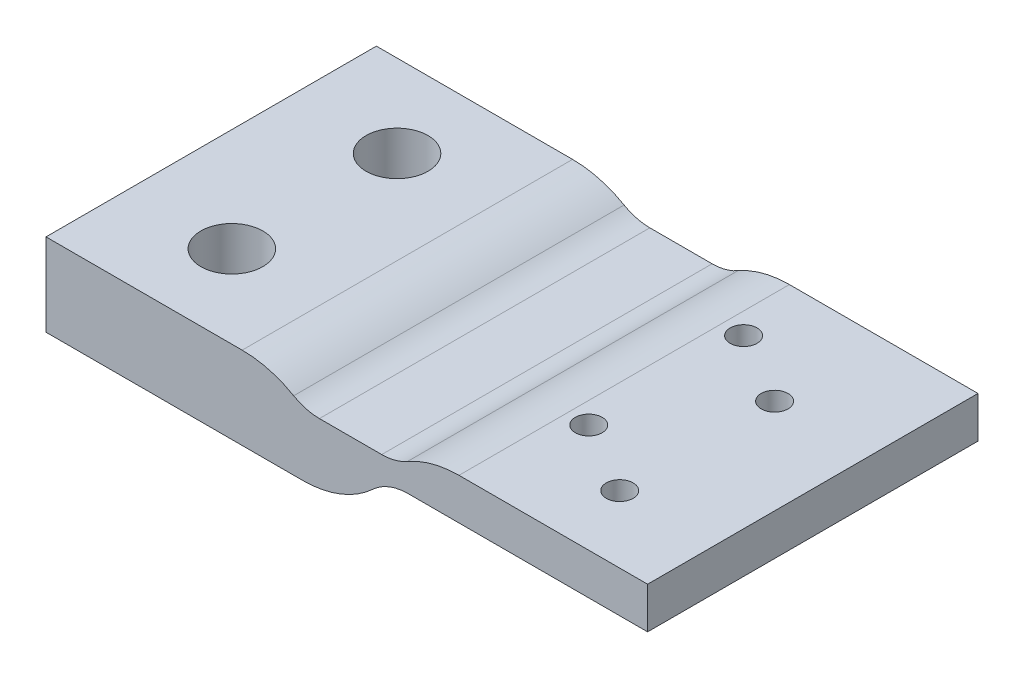
ISO-10303-21;
HEADER;
FILE_DESCRIPTION(('STEP AP214'),'2;1');
FILE_NAME('part.step','',(''),(''),'','','');
FILE_SCHEMA(('AUTOMOTIVE_DESIGN { 1 0 10303 214 1 1 1 1 }'));
ENDSEC;
DATA;
#1=APPLICATION_CONTEXT('core data for automotive mechanical design processes');
#2=APPLICATION_PROTOCOL_DEFINITION('international standard','automotive_design',2000,#1);
#3=PRODUCT_CONTEXT('',#1,'mechanical');
#4=PRODUCT('Part','Part','',(#3));
#5=PRODUCT_RELATED_PRODUCT_CATEGORY('part','',(#4));
#6=PRODUCT_DEFINITION_FORMATION('','',#4);
#7=PRODUCT_DEFINITION_CONTEXT('part definition',#1,'design');
#8=PRODUCT_DEFINITION('design','',#6,#7);
#9=PRODUCT_DEFINITION_SHAPE('','',#8);
#10=(LENGTH_UNIT() NAMED_UNIT(*) SI_UNIT(.MILLI.,.METRE.));
#11=(NAMED_UNIT(*) PLANE_ANGLE_UNIT() SI_UNIT($,.RADIAN.));
#12=(NAMED_UNIT(*) SI_UNIT($,.STERADIAN.) SOLID_ANGLE_UNIT());
#13=UNCERTAINTY_MEASURE_WITH_UNIT(LENGTH_MEASURE(1.E-05),#10,'distance_accuracy_value','');
#14=(GEOMETRIC_REPRESENTATION_CONTEXT(3) GLOBAL_UNCERTAINTY_ASSIGNED_CONTEXT((#13)) GLOBAL_UNIT_ASSIGNED_CONTEXT((#10,
#11,#12)) REPRESENTATION_CONTEXT('',''));
#15=CARTESIAN_POINT('',(0.,0.,0.));
#16=DIRECTION('',(0.,0.,1.));
#17=DIRECTION('',(1.,0.,0.));
#18=AXIS2_PLACEMENT_3D('',#15,#16,#17);
#19=CARTESIAN_POINT('',(0.,-3.,0.));
#20=DIRECTION('',(0.,1.,0.));
#21=DIRECTION('',(0.,0.,1.));
#22=AXIS2_PLACEMENT_3D('',#19,#20,#21);
#23=PLANE('',#22);
#24=DIRECTION('',(-1.,0.,0.));
#25=VECTOR('',#24,1.);
#26=CARTESIAN_POINT('',(-10.6666666666667,-3.,-16.));
#27=LINE('',#26,#25);
#28=CARTESIAN_POINT('',(-2.46666666666651,-3.,-16.));
#29=VERTEX_POINT('',#28);
#30=CARTESIAN_POINT('',(-10.6666666666667,-3.,-16.));
#31=VERTEX_POINT('',#30);
#32=EDGE_CURVE('E214',#29,#31,#27,.T.);
#33=ORIENTED_EDGE('',*,*,#32,.F.);
#34=CARTESIAN_POINT('',(-0.666666666666669,-3.,-7.99999999999998));
#35=DIRECTION('',(0.,1.,0.));
#36=DIRECTION('',(0.,0.,1.));
#37=AXIS2_PLACEMENT_3D('',#34,#35,#36);
#38=CIRCLE('',#37,8.2);
#39=CARTESIAN_POINT('',(-8.86666666666667,-3.,-7.99999999999998));
#40=VERTEX_POINT('',#39);
#41=EDGE_CURVE('E290',#29,#40,#38,.T.);
#42=ORIENTED_EDGE('',*,*,#41,.T.);
#43=DIRECTION('',(0.,0.,1.));
#44=VECTOR('',#43,1.);
#45=CARTESIAN_POINT('',(-8.86666666666667,-3.,0.));
#46=LINE('',#45,#44);
#47=CARTESIAN_POINT('',(-8.86666666666667,-3.,7.99999999999999));
#48=VERTEX_POINT('',#47);
#49=EDGE_CURVE('E173',#40,#48,#46,.T.);
#50=ORIENTED_EDGE('',*,*,#49,.T.);
#51=CARTESIAN_POINT('',(-0.666666666666668,-3.,7.99999999999999));
#52=DIRECTION('',(0.,1.,0.));
#53=DIRECTION('',(0.,0.,1.));
#54=AXIS2_PLACEMENT_3D('',#51,#52,#53);
#55=CIRCLE('',#54,8.2);
#56=CARTESIAN_POINT('',(-2.46666666666667,-3.,16.));
#57=VERTEX_POINT('',#56);
#58=EDGE_CURVE('E287',#48,#57,#55,.T.);
#59=ORIENTED_EDGE('',*,*,#58,.T.);
#60=DIRECTION('',(1.,0.,0.));
#61=VECTOR('',#60,1.);
#62=CARTESIAN_POINT('',(-10.6666666666667,-3.,16.));
#63=LINE('',#62,#61);
#64=CARTESIAN_POINT('',(-10.6666666666667,-3.,16.));
#65=VERTEX_POINT('',#64);
#66=EDGE_CURVE('E211',#65,#57,#63,.T.);
#67=ORIENTED_EDGE('',*,*,#66,.F.);
#68=DIRECTION('',(0.,0.,1.));
#69=VECTOR('',#68,1.);
#70=CARTESIAN_POINT('',(-10.6666666666667,-3.,-16.));
#71=LINE('',#70,#69);
#72=EDGE_CURVE('E205',#31,#65,#71,.T.);
#73=ORIENTED_EDGE('',*,*,#72,.F.);
#74=EDGE_LOOP('',(#33,#42,#50,#59,#67,#73));
#75=FACE_BOUND('',#74,.T.);
#76=ADVANCED_FACE('F35',(#75),#23,.F.);
#77=CARTESIAN_POINT('',(0.,5.,0.));
#78=DIRECTION('',(0.,-1.,0.));
#79=DIRECTION('',(0.,0.,-1.));
#80=AXIS2_PLACEMENT_3D('',#77,#78,#79);
#81=PLANE('',#80);
#82=CARTESIAN_POINT('',(-0.666666666666669,5.,-7.99999999999998));
#83=DIRECTION('',(0.,1.,0.));
#84=DIRECTION('',(0.,0.,1.));
#85=AXIS2_PLACEMENT_3D('',#82,#83,#84);
#86=CIRCLE('',#85,3.);
#87=CARTESIAN_POINT('',(-0.666666666666669,5.,-4.99999999999998));
#88=VERTEX_POINT('',#87);
#89=EDGE_CURVE('E202',#88,#88,#86,.T.);
#90=ORIENTED_EDGE('',*,*,#89,.F.);
#91=EDGE_LOOP('',(#90));
#92=FACE_BOUND('',#91,.T.);
#93=CARTESIAN_POINT('',(-0.666666666666668,5.,7.99999999999999));
#94=DIRECTION('',(0.,1.,0.));
#95=DIRECTION('',(0.,0.,1.));
#96=AXIS2_PLACEMENT_3D('',#93,#94,#95);
#97=CIRCLE('',#96,3.);
#98=CARTESIAN_POINT('',(-0.666666666666668,5.,11.));
#99=VERTEX_POINT('',#98);
#100=EDGE_CURVE('E201',#99,#99,#97,.T.);
#101=ORIENTED_EDGE('',*,*,#100,.F.);
#102=EDGE_LOOP('',(#101));
#103=FACE_BOUND('',#102,.T.);
#104=DIRECTION('',(1.,0.,0.));
#105=VECTOR('',#104,1.);
#106=CARTESIAN_POINT('',(10.6666666666667,5.,16.));
#107=LINE('',#106,#105);
#108=CARTESIAN_POINT('',(-10.6666666666667,5.,16.));
#109=VERTEX_POINT('',#108);
#110=CARTESIAN_POINT('',(8.33333333333331,5.,16.));
#111=VERTEX_POINT('',#110);
#112=EDGE_CURVE('E264',#109,#111,#107,.T.);
#113=ORIENTED_EDGE('',*,*,#112,.T.);
#114=DIRECTION('',(0.,0.,1.));
#115=VECTOR('',#114,1.);
#116=CARTESIAN_POINT('',(8.33333333333331,5.,0.));
#117=LINE('',#116,#115);
#118=CARTESIAN_POINT('',(8.33333333333331,5.,-16.));
#119=VERTEX_POINT('',#118);
#120=EDGE_CURVE('E388',#111,#119,#117,.F.);
#121=ORIENTED_EDGE('',*,*,#120,.T.);
#122=DIRECTION('',(-1.,0.,0.));
#123=VECTOR('',#122,1.);
#124=CARTESIAN_POINT('',(10.6666666666667,5.,-16.));
#125=LINE('',#124,#123);
#126=CARTESIAN_POINT('',(-10.6666666666667,5.,-16.));
#127=VERTEX_POINT('',#126);
#128=EDGE_CURVE('E267',#119,#127,#125,.T.);
#129=ORIENTED_EDGE('',*,*,#128,.T.);
#130=DIRECTION('',(0.,0.,1.));
#131=VECTOR('',#130,1.);
#132=CARTESIAN_POINT('',(-10.6666666666667,5.,-16.));
#133=LINE('',#132,#131);
#134=EDGE_CURVE('E260',#127,#109,#133,.T.);
#135=ORIENTED_EDGE('',*,*,#134,.T.);
#136=EDGE_LOOP('',(#113,#121,#129,#135));
#137=FACE_BOUND('',#136,.T.);
#138=ADVANCED_FACE('F324',(#92,#103,#137),#81,.F.);
#139=CARTESIAN_POINT('',(-10.6666666666667,5.,-16.));
#140=DIRECTION('',(1.,0.,0.));
#141=DIRECTION('',(0.,0.,-1.));
#142=AXIS2_PLACEMENT_3D('',#139,#140,#141);
#143=PLANE('',#142);
#144=DIRECTION('',(0.,-1.,0.));
#145=VECTOR('',#144,1.);
#146=CARTESIAN_POINT('',(-10.6666666666667,5.,-16.));
#147=LINE('',#146,#145);
#148=EDGE_CURVE('E271',#127,#31,#147,.T.);
#149=ORIENTED_EDGE('',*,*,#148,.T.);
#150=ORIENTED_EDGE('',*,*,#72,.T.);
#151=DIRECTION('',(0.,-1.,0.));
#152=VECTOR('',#151,1.);
#153=CARTESIAN_POINT('',(-10.6666666666667,5.,16.));
#154=LINE('',#153,#152);
#155=EDGE_CURVE('E274',#109,#65,#154,.T.);
#156=ORIENTED_EDGE('',*,*,#155,.F.);
#157=ORIENTED_EDGE('',*,*,#134,.F.);
#158=EDGE_LOOP('',(#149,#150,#156,#157));
#159=FACE_BOUND('',#158,.T.);
#160=ADVANCED_FACE('F321',(#159),#143,.F.);
#161=CARTESIAN_POINT('',(10.6666666666667,5.,16.));
#162=DIRECTION('',(0.,0.,-1.));
#163=DIRECTION('',(-1.,0.,0.));
#164=AXIS2_PLACEMENT_3D('',#161,#162,#163);
#165=PLANE('',#164);
#166=CARTESIAN_POINT('',(1.13333333333333,-3.,16.));
#167=VERTEX_POINT('',#166);
#168=CARTESIAN_POINT('',(14.2,-3.,16.));
#169=VERTEX_POINT('',#168);
#170=EDGE_CURVE('E210',#167,#169,#63,.T.);
#171=ORIENTED_EDGE('',*,*,#170,.T.);
#172=CARTESIAN_POINT('',(14.2,7.,16.));
#173=DIRECTION('',(0.,0.,-1.));
#174=DIRECTION('',(-1.,0.,0.));
#175=AXIS2_PLACEMENT_3D('',#172,#173,#174);
#176=CIRCLE('',#175,10.);
#177=CARTESIAN_POINT('',(20.9986926847904,-0.333333333333335,16.));
#178=VERTEX_POINT('',#177);
#179=EDGE_CURVE('E373',#169,#178,#176,.F.);
#180=ORIENTED_EDGE('',*,*,#179,.T.);
#181=CARTESIAN_POINT('',(24.3980390271856,-4.,16.));
#182=DIRECTION('',(0.,0.,-1.));
#183=DIRECTION('',(-1.,0.,0.));
#184=AXIS2_PLACEMENT_3D('',#181,#182,#183);
#185=CIRCLE('',#184,5.);
#186=CARTESIAN_POINT('',(24.3980390271856,0.999999999999997,16.));
#187=VERTEX_POINT('',#186);
#188=EDGE_CURVE('E43',#178,#187,#185,.T.);
#189=ORIENTED_EDGE('',*,*,#188,.T.);
#190=DIRECTION('',(-1.,0.,0.));
#191=VECTOR('',#190,1.);
#192=CARTESIAN_POINT('',(47.6,1.,16.));
#193=LINE('',#192,#191);
#194=CARTESIAN_POINT('',(47.6,1.,16.));
#195=VERTEX_POINT('',#194);
#196=EDGE_CURVE('E218',#195,#187,#193,.T.);
#197=ORIENTED_EDGE('',*,*,#196,.F.);
#198=DIRECTION('',(0.,-1.,0.));
#199=VECTOR('',#198,1.);
#200=CARTESIAN_POINT('',(47.6,5.,16.));
#201=LINE('',#200,#199);
#202=CARTESIAN_POINT('',(47.6,5.,16.));
#203=VERTEX_POINT('',#202);
#204=EDGE_CURVE('E257',#203,#195,#201,.T.);
#205=ORIENTED_EDGE('',*,*,#204,.F.);
#206=CARTESIAN_POINT('',(29.3333333333333,5.,16.));
#207=VERTEX_POINT('',#206);
#208=EDGE_CURVE('E263',#207,#203,#107,.T.);
#209=ORIENTED_EDGE('',*,*,#208,.F.);
#210=CARTESIAN_POINT('',(29.3333333333333,-5.,16.));
#211=DIRECTION('',(0.,0.,-1.));
#212=DIRECTION('',(-1.,0.,0.));
#213=AXIS2_PLACEMENT_3D('',#210,#211,#212);
#214=CIRCLE('',#213,10.);
#215=CARTESIAN_POINT('',(24.3444568176347,3.66666666666667,16.));
#216=VERTEX_POINT('',#215);
#217=EDGE_CURVE('E376',#207,#216,#214,.F.);
#218=ORIENTED_EDGE('',*,*,#217,.T.);
#219=CARTESIAN_POINT('',(21.8500185597854,8.,16.));
#220=DIRECTION('',(0.,0.,-1.));
#221=DIRECTION('',(-1.,0.,0.));
#222=AXIS2_PLACEMENT_3D('',#219,#220,#221);
#223=CIRCLE('',#222,5.);
#224=CARTESIAN_POINT('',(21.8500185597854,3.,16.));
#225=VERTEX_POINT('',#224);
#226=EDGE_CURVE('E403',#216,#225,#223,.T.);
#227=ORIENTED_EDGE('',*,*,#226,.T.);
#228=DIRECTION('',(1.,0.,0.));
#229=VECTOR('',#228,1.);
#230=CARTESIAN_POINT('',(14.3333333333333,3.,16.));
#231=LINE('',#230,#229);
#232=CARTESIAN_POINT('',(15.8166481068812,3.,16.));
#233=VERTEX_POINT('',#232);
#234=EDGE_CURVE('E217',#233,#225,#231,.T.);
#235=ORIENTED_EDGE('',*,*,#234,.F.);
#236=CARTESIAN_POINT('',(15.8166481068812,8.,16.));
#237=DIRECTION('',(0.,0.,-1.));
#238=DIRECTION('',(-1.,0.,0.));
#239=AXIS2_PLACEMENT_3D('',#236,#237,#238);
#240=CIRCLE('',#239,5.);
#241=CARTESIAN_POINT('',(13.3222098490319,3.66666666666667,16.));
#242=VERTEX_POINT('',#241);
#243=EDGE_CURVE('E407',#233,#242,#240,.T.);
#244=ORIENTED_EDGE('',*,*,#243,.T.);
#245=CARTESIAN_POINT('',(8.33333333333331,-5.,16.));
#246=DIRECTION('',(0.,0.,-1.));
#247=DIRECTION('',(-1.,0.,0.));
#248=AXIS2_PLACEMENT_3D('',#245,#246,#247);
#249=CIRCLE('',#248,10.);
#250=EDGE_CURVE('E374',#242,#111,#249,.F.);
#251=ORIENTED_EDGE('',*,*,#250,.T.);
#252=ORIENTED_EDGE('',*,*,#112,.F.);
#253=ORIENTED_EDGE('',*,*,#155,.T.);
#254=ORIENTED_EDGE('',*,*,#66,.T.);
#255=CARTESIAN_POINT('',(-2.46666666666667,-3.,16.));
#256=CARTESIAN_POINT('',(-2.31666363402031,-2.99996878127074,16.));
#257=CARTESIAN_POINT('',(-2.16666268041997,-2.99945601927189,16.));
#258=CARTESIAN_POINT('',(-1.86666113366037,-2.99802659047522,16.));
#259=CARTESIAN_POINT('',(-1.71666054051575,-2.99710992014173,16.));
#260=CARTESIAN_POINT('',(-1.41666147428542,-2.99543189293806,16.));
#261=CARTESIAN_POINT('',(-1.26666300121556,-2.99467053303326,16.));
#262=CARTESIAN_POINT('',(-0.966665240976342,-2.9936175430343,16.));
#263=CARTESIAN_POINT('',(-0.816665953821505,-2.99332590941915,16.));
#264=CARTESIAN_POINT('',(-0.516667379511832,-2.99332590941915,16.));
#265=CARTESIAN_POINT('',(-0.366668092356995,-2.9936175430343,16.));
#266=CARTESIAN_POINT('',(-0.0666703321177728,-2.99467053303326,16.));
#267=CARTESIAN_POINT('',(0.0833281409520829,-2.99543189293806,16.));
#268=CARTESIAN_POINT('',(0.383327207182409,-2.99710992014173,16.));
#269=CARTESIAN_POINT('',(0.533327800327031,-2.99802659047522,16.));
#270=CARTESIAN_POINT('',(0.833329347086637,-2.99945601927189,16.));
#271=CARTESIAN_POINT('',(0.983330300686973,-2.99996878127074,16.));
#272=CARTESIAN_POINT('',(1.13333333333333,-3.,16.));
#273=B_SPLINE_CURVE_WITH_KNOTS('',3,(#255,#256,#257,#258,#259,#260,#261,#262,#263,#264,#265,
#266,#267,#268,#269,#270,#271,#272),.UNSPECIFIED.,.F.,.F.,(4,2,2,2,2,2,2,2,4),(0.,
0.450005863408642,0.900015666092677,1.35001667518365,1.80001431113164,2.25001194707964,
2.70001295617061,3.15002275885464,3.60002862226329),.UNSPECIFIED.);
#274=EDGE_CURVE('E300',#57,#167,#273,.T.);
#275=ORIENTED_EDGE('',*,*,#274,.T.);
#276=EDGE_LOOP('',(#171,#180,#189,#197,#205,#209,#218,#227,#235,#244,#251,#252,#253,#254,#275));
#277=FACE_BOUND('',#276,.T.);
#278=ADVANCED_FACE('F315',(#277),#165,.F.);
#279=CARTESIAN_POINT('',(10.6666666666667,5.,-16.));
#280=DIRECTION('',(0.,0.,1.));
#281=DIRECTION('',(1.,0.,0.));
#282=AXIS2_PLACEMENT_3D('',#279,#280,#281);
#283=PLANE('',#282);
#284=DIRECTION('',(-1.,0.,0.));
#285=VECTOR('',#284,1.);
#286=CARTESIAN_POINT('',(47.6,1.,-16.));
#287=LINE('',#286,#285);
#288=CARTESIAN_POINT('',(47.6,1.,-16.));
#289=VERTEX_POINT('',#288);
#290=CARTESIAN_POINT('',(24.3980390271856,0.999999999999997,-16.));
#291=VERTEX_POINT('',#290);
#292=EDGE_CURVE('E220',#289,#291,#287,.T.);
#293=ORIENTED_EDGE('',*,*,#292,.T.);
#294=CARTESIAN_POINT('',(24.3980390271856,-4.,-16.));
#295=DIRECTION('',(0.,0.,1.));
#296=DIRECTION('',(1.,0.,0.));
#297=AXIS2_PLACEMENT_3D('',#294,#295,#296);
#298=CIRCLE('',#297,5.);
#299=CARTESIAN_POINT('',(20.9986926847904,-0.333333333333335,-16.));
#300=VERTEX_POINT('',#299);
#301=EDGE_CURVE('E11',#291,#300,#298,.T.);
#302=ORIENTED_EDGE('',*,*,#301,.T.);
#303=CARTESIAN_POINT('',(14.2,7.,-16.));
#304=DIRECTION('',(0.,0.,1.));
#305=DIRECTION('',(1.,0.,0.));
#306=AXIS2_PLACEMENT_3D('',#303,#304,#305);
#307=CIRCLE('',#306,10.);
#308=CARTESIAN_POINT('',(14.2,-3.,-16.));
#309=VERTEX_POINT('',#308);
#310=EDGE_CURVE('E371',#300,#309,#307,.F.);
#311=ORIENTED_EDGE('',*,*,#310,.T.);
#312=CARTESIAN_POINT('',(1.13333333333317,-3.,-16.));
#313=VERTEX_POINT('',#312);
#314=EDGE_CURVE('E215',#309,#313,#27,.T.);
#315=ORIENTED_EDGE('',*,*,#314,.T.);
#316=CARTESIAN_POINT('',(1.13333333333317,-3.,-16.));
#317=CARTESIAN_POINT('',(0.983330300686831,-2.99996878127074,-16.));
#318=CARTESIAN_POINT('',(0.833329347086508,-2.99945601927189,-16.));
#319=CARTESIAN_POINT('',(0.533327800326928,-2.99802659047522,-16.));
#320=CARTESIAN_POINT('',(0.383327207182319,-2.99710992014173,-16.));
#321=CARTESIAN_POINT('',(0.0833281409520189,-2.99543189293806,-16.));
#322=CARTESIAN_POINT('',(-0.0666703321178239,-2.99467053303327,-16.));
#323=CARTESIAN_POINT('',(-0.366668092357021,-2.99361754303431,-16.));
#324=CARTESIAN_POINT('',(-0.516667379511845,-2.99332590941916,-16.));
#325=CARTESIAN_POINT('',(-0.816665953821492,-2.99332590941916,-16.));
#326=CARTESIAN_POINT('',(-0.966665240976316,-2.99361754303431,-16.));
#327=CARTESIAN_POINT('',(-1.26666300121551,-2.99467053303327,-16.));
#328=CARTESIAN_POINT('',(-1.41666147428536,-2.99543189293806,-16.));
#329=CARTESIAN_POINT('',(-1.71666054051566,-2.99710992014173,-16.));
#330=CARTESIAN_POINT('',(-1.86666113366026,-2.99802659047522,-16.));
#331=CARTESIAN_POINT('',(-2.16666268041985,-2.99945601927189,-16.));
#332=CARTESIAN_POINT('',(-2.31666363402017,-2.99996878127074,-16.));
#333=CARTESIAN_POINT('',(-2.46666666666651,-3.,-16.));
#334=B_SPLINE_CURVE_WITH_KNOTS('',3,(#316,#317,#318,#319,#320,#321,#322,#323,#324,#325,#326,
#327,#328,#329,#330,#331,#332,#333),.UNSPECIFIED.,.F.,.F.,(4,2,2,2,2,2,2,2,4),(0.,
0.450005863408603,0.9000156660926,1.35001667518353,1.80001431113149,2.25001194707945,
2.70001295617038,3.15002275885437,3.60002862226298),.UNSPECIFIED.);
#335=EDGE_CURVE('E292',#313,#29,#334,.T.);
#336=ORIENTED_EDGE('',*,*,#335,.T.);
#337=ORIENTED_EDGE('',*,*,#32,.T.);
#338=ORIENTED_EDGE('',*,*,#148,.F.);
#339=ORIENTED_EDGE('',*,*,#128,.F.);
#340=CARTESIAN_POINT('',(8.33333333333331,-5.,-16.));
#341=DIRECTION('',(0.,0.,1.));
#342=DIRECTION('',(1.,0.,0.));
#343=AXIS2_PLACEMENT_3D('',#340,#341,#342);
#344=CIRCLE('',#343,10.);
#345=CARTESIAN_POINT('',(13.3222098490319,3.66666666666667,-16.));
#346=VERTEX_POINT('',#345);
#347=EDGE_CURVE('E416',#119,#346,#344,.F.);
#348=ORIENTED_EDGE('',*,*,#347,.T.);
#349=CARTESIAN_POINT('',(15.8166481068812,8.,-16.));
#350=DIRECTION('',(0.,0.,1.));
#351=DIRECTION('',(1.,0.,0.));
#352=AXIS2_PLACEMENT_3D('',#349,#350,#351);
#353=CIRCLE('',#352,5.);
#354=CARTESIAN_POINT('',(15.8166481068812,3.,-16.));
#355=VERTEX_POINT('',#354);
#356=EDGE_CURVE('E409',#346,#355,#353,.T.);
#357=ORIENTED_EDGE('',*,*,#356,.T.);
#358=DIRECTION('',(1.,0.,0.));
#359=VECTOR('',#358,1.);
#360=CARTESIAN_POINT('',(14.3333333333333,3.,-16.));
#361=LINE('',#360,#359);
#362=CARTESIAN_POINT('',(21.8500185597854,3.,-16.));
#363=VERTEX_POINT('',#362);
#364=EDGE_CURVE('E221',#355,#363,#361,.T.);
#365=ORIENTED_EDGE('',*,*,#364,.T.);
#366=CARTESIAN_POINT('',(21.8500185597854,8.,-16.));
#367=DIRECTION('',(0.,0.,1.));
#368=DIRECTION('',(1.,0.,0.));
#369=AXIS2_PLACEMENT_3D('',#366,#367,#368);
#370=CIRCLE('',#369,5.);
#371=CARTESIAN_POINT('',(24.3444568176347,3.66666666666667,-16.));
#372=VERTEX_POINT('',#371);
#373=EDGE_CURVE('E405',#363,#372,#370,.T.);
#374=ORIENTED_EDGE('',*,*,#373,.T.);
#375=CARTESIAN_POINT('',(29.3333333333333,-5.,-16.));
#376=DIRECTION('',(0.,0.,1.));
#377=DIRECTION('',(1.,0.,0.));
#378=AXIS2_PLACEMENT_3D('',#375,#376,#377);
#379=CIRCLE('',#378,10.);
#380=CARTESIAN_POINT('',(29.3333333333333,5.,-16.));
#381=VERTEX_POINT('',#380);
#382=EDGE_CURVE('E378',#372,#381,#379,.F.);
#383=ORIENTED_EDGE('',*,*,#382,.T.);
#384=CARTESIAN_POINT('',(47.6,5.,-16.));
#385=VERTEX_POINT('',#384);
#386=EDGE_CURVE('E268',#385,#381,#125,.T.);
#387=ORIENTED_EDGE('',*,*,#386,.F.);
#388=DIRECTION('',(0.,-1.,0.));
#389=VECTOR('',#388,1.);
#390=CARTESIAN_POINT('',(47.6,5.,-16.));
#391=LINE('',#390,#389);
#392=EDGE_CURVE('E254',#385,#289,#391,.T.);
#393=ORIENTED_EDGE('',*,*,#392,.T.);
#394=EDGE_LOOP('',(#293,#302,#311,#315,#336,#337,#338,#339,#348,#357,#365,#374,#383,#387,#393));
#395=FACE_BOUND('',#394,.T.);
#396=ADVANCED_FACE('F310',(#395),#283,.F.);
#397=CARTESIAN_POINT('',(38.4,5.,9.50000000000001));
#398=DIRECTION('',(0.,-1.,0.));
#399=DIRECTION('',(0.,0.,-1.));
#400=AXIS2_PLACEMENT_3D('',#397,#398,#399);
#401=CIRCLE('',#400,1.3);
#402=CARTESIAN_POINT('',(38.4,5.,8.20000000000001));
#403=VERTEX_POINT('',#402);
#404=EDGE_CURVE('E248',#403,#403,#401,.F.);
#405=ORIENTED_EDGE('',*,*,#404,.F.);
#406=EDGE_LOOP('',(#405));
#407=FACE_BOUND('',#406,.T.);
#408=CARTESIAN_POINT('',(31.4,5.,5.50000000000001));
#409=DIRECTION('',(0.,-1.,0.));
#410=DIRECTION('',(0.,0.,-1.));
#411=AXIS2_PLACEMENT_3D('',#408,#409,#410);
#412=CIRCLE('',#411,1.3);
#413=CARTESIAN_POINT('',(31.4,5.,4.2));
#414=VERTEX_POINT('',#413);
#415=EDGE_CURVE('E245',#414,#414,#412,.F.);
#416=ORIENTED_EDGE('',*,*,#415,.F.);
#417=EDGE_LOOP('',(#416));
#418=FACE_BOUND('',#417,.T.);
#419=CARTESIAN_POINT('',(38.4,5.,-5.49999999999999));
#420=DIRECTION('',(0.,-1.,0.));
#421=DIRECTION('',(0.,0.,-1.));
#422=AXIS2_PLACEMENT_3D('',#419,#420,#421);
#423=CIRCLE('',#422,1.3);
#424=CARTESIAN_POINT('',(38.4,5.,-6.79999999999999));
#425=VERTEX_POINT('',#424);
#426=EDGE_CURVE('E242',#425,#425,#423,.F.);
#427=ORIENTED_EDGE('',*,*,#426,.F.);
#428=EDGE_LOOP('',(#427));
#429=FACE_BOUND('',#428,.T.);
#430=CARTESIAN_POINT('',(31.4,5.,-9.49999999999999));
#431=DIRECTION('',(0.,-1.,0.));
#432=DIRECTION('',(0.,0.,-1.));
#433=AXIS2_PLACEMENT_3D('',#430,#431,#432);
#434=CIRCLE('',#433,1.3);
#435=CARTESIAN_POINT('',(31.4,5.,-10.8));
#436=VERTEX_POINT('',#435);
#437=EDGE_CURVE('E239',#436,#436,#434,.F.);
#438=ORIENTED_EDGE('',*,*,#437,.F.);
#439=EDGE_LOOP('',(#438));
#440=FACE_BOUND('',#439,.T.);
#441=ORIENTED_EDGE('',*,*,#386,.T.);
#442=DIRECTION('',(0.,0.,-1.));
#443=VECTOR('',#442,1.);
#444=CARTESIAN_POINT('',(29.3333333333333,5.,0.));
#445=LINE('',#444,#443);
#446=EDGE_CURVE('E385',#381,#207,#445,.F.);
#447=ORIENTED_EDGE('',*,*,#446,.T.);
#448=ORIENTED_EDGE('',*,*,#208,.T.);
#449=DIRECTION('',(0.,0.,-1.));
#450=VECTOR('',#449,1.);
#451=CARTESIAN_POINT('',(47.6,5.,16.));
#452=LINE('',#451,#450);
#453=EDGE_CURVE('E251',#203,#385,#452,.T.);
#454=ORIENTED_EDGE('',*,*,#453,.T.);
#455=EDGE_LOOP('',(#441,#447,#448,#454));
#456=FACE_BOUND('',#455,.T.);
#457=ADVANCED_FACE('F314',(#407,#418,#429,#440,#456),#81,.F.);
#458=CARTESIAN_POINT('',(47.6,5.,16.));
#459=DIRECTION('',(-1.,0.,0.));
#460=DIRECTION('',(0.,0.,1.));
#461=AXIS2_PLACEMENT_3D('',#458,#459,#460);
#462=PLANE('',#461);
#463=ORIENTED_EDGE('',*,*,#204,.T.);
#464=DIRECTION('',(0.,0.,1.));
#465=VECTOR('',#464,1.);
#466=CARTESIAN_POINT('',(47.6,1.,-16.));
#467=LINE('',#466,#465);
#468=EDGE_CURVE('E223',#289,#195,#467,.T.);
#469=ORIENTED_EDGE('',*,*,#468,.F.);
#470=ORIENTED_EDGE('',*,*,#392,.F.);
#471=ORIENTED_EDGE('',*,*,#453,.F.);
#472=EDGE_LOOP('',(#463,#469,#470,#471));
#473=FACE_BOUND('',#472,.T.);
#474=ADVANCED_FACE('F471',(#473),#462,.F.);
#475=CARTESIAN_POINT('',(31.4,10.,-9.49999999999999));
#476=DIRECTION('',(0.,-1.,0.));
#477=DIRECTION('',(0.,0.,-1.));
#478=AXIS2_PLACEMENT_3D('',#475,#476,#477);
#479=CYLINDRICAL_SURFACE('',#478,1.3);
#480=CARTESIAN_POINT('',(31.4,0.999999999999997,-9.49999999999999));
#481=DIRECTION('',(0.,1.,0.));
#482=DIRECTION('',(-1.,0.,0.));
#483=AXIS2_PLACEMENT_3D('',#480,#481,#482);
#484=CIRCLE('',#483,1.3);
#485=CARTESIAN_POINT('',(30.1,0.999999999999997,-9.49999999999999));
#486=VERTEX_POINT('',#485);
#487=EDGE_CURVE('E236',#486,#486,#484,.T.);
#488=ORIENTED_EDGE('',*,*,#487,.F.);
#489=EDGE_LOOP('',(#488));
#490=FACE_BOUND('',#489,.T.);
#491=ORIENTED_EDGE('',*,*,#437,.T.);
#492=EDGE_LOOP('',(#491));
#493=FACE_BOUND('',#492,.T.);
#494=ADVANCED_FACE('F484',(#490,#493),#479,.F.);
#495=CARTESIAN_POINT('',(38.4,10.,-5.49999999999999));
#496=DIRECTION('',(0.,-1.,0.));
#497=DIRECTION('',(0.,0.,-1.));
#498=AXIS2_PLACEMENT_3D('',#495,#496,#497);
#499=CYLINDRICAL_SURFACE('',#498,1.3);
#500=CARTESIAN_POINT('',(38.4,0.999999999999997,-5.49999999999999));
#501=DIRECTION('',(0.,1.,0.));
#502=DIRECTION('',(-1.,0.,0.));
#503=AXIS2_PLACEMENT_3D('',#500,#501,#502);
#504=CIRCLE('',#503,1.3);
#505=CARTESIAN_POINT('',(37.1,0.999999999999997,-5.49999999999999));
#506=VERTEX_POINT('',#505);
#507=EDGE_CURVE('E233',#506,#506,#504,.T.);
#508=ORIENTED_EDGE('',*,*,#507,.F.);
#509=EDGE_LOOP('',(#508));
#510=FACE_BOUND('',#509,.T.);
#511=ORIENTED_EDGE('',*,*,#426,.T.);
#512=EDGE_LOOP('',(#511));
#513=FACE_BOUND('',#512,.T.);
#514=ADVANCED_FACE('F494',(#510,#513),#499,.F.);
#515=CARTESIAN_POINT('',(31.4,10.,5.50000000000001));
#516=DIRECTION('',(0.,-1.,0.));
#517=DIRECTION('',(0.,0.,-1.));
#518=AXIS2_PLACEMENT_3D('',#515,#516,#517);
#519=CYLINDRICAL_SURFACE('',#518,1.3);
#520=CARTESIAN_POINT('',(31.4,0.999999999999997,5.50000000000001));
#521=DIRECTION('',(0.,1.,0.));
#522=DIRECTION('',(-1.,0.,0.));
#523=AXIS2_PLACEMENT_3D('',#520,#521,#522);
#524=CIRCLE('',#523,1.3);
#525=CARTESIAN_POINT('',(30.1,0.999999999999997,5.50000000000001));
#526=VERTEX_POINT('',#525);
#527=EDGE_CURVE('E230',#526,#526,#524,.T.);
#528=ORIENTED_EDGE('',*,*,#527,.F.);
#529=EDGE_LOOP('',(#528));
#530=FACE_BOUND('',#529,.T.);
#531=ORIENTED_EDGE('',*,*,#415,.T.);
#532=EDGE_LOOP('',(#531));
#533=FACE_BOUND('',#532,.T.);
#534=ADVANCED_FACE('F500',(#530,#533),#519,.F.);
#535=CARTESIAN_POINT('',(38.4,10.,9.50000000000001));
#536=DIRECTION('',(0.,-1.,0.));
#537=DIRECTION('',(0.,0.,-1.));
#538=AXIS2_PLACEMENT_3D('',#535,#536,#537);
#539=CYLINDRICAL_SURFACE('',#538,1.3);
#540=CARTESIAN_POINT('',(38.4,0.999999999999997,9.50000000000001));
#541=DIRECTION('',(0.,1.,0.));
#542=DIRECTION('',(-1.,0.,0.));
#543=AXIS2_PLACEMENT_3D('',#540,#541,#542);
#544=CIRCLE('',#543,1.3);
#545=CARTESIAN_POINT('',(37.1,0.999999999999997,9.50000000000001));
#546=VERTEX_POINT('',#545);
#547=EDGE_CURVE('E225',#546,#546,#544,.T.);
#548=ORIENTED_EDGE('',*,*,#547,.F.);
#549=EDGE_LOOP('',(#548));
#550=FACE_BOUND('',#549,.T.);
#551=ORIENTED_EDGE('',*,*,#404,.T.);
#552=EDGE_LOOP('',(#551));
#553=FACE_BOUND('',#552,.T.);
#554=ADVANCED_FACE('F507',(#550,#553),#539,.F.);
#555=CARTESIAN_POINT('',(47.6,1.,-16.));
#556=DIRECTION('',(0.,1.,0.));
#557=DIRECTION('',(-1.,0.,0.));
#558=AXIS2_PLACEMENT_3D('',#555,#556,#557);
#559=PLANE('',#558);
#560=ORIENTED_EDGE('',*,*,#487,.T.);
#561=EDGE_LOOP('',(#560));
#562=FACE_BOUND('',#561,.T.);
#563=ORIENTED_EDGE('',*,*,#507,.T.);
#564=EDGE_LOOP('',(#563));
#565=FACE_BOUND('',#564,.T.);
#566=ORIENTED_EDGE('',*,*,#527,.T.);
#567=EDGE_LOOP('',(#566));
#568=FACE_BOUND('',#567,.T.);
#569=ORIENTED_EDGE('',*,*,#547,.T.);
#570=EDGE_LOOP('',(#569));
#571=FACE_BOUND('',#570,.T.);
#572=ORIENTED_EDGE('',*,*,#196,.T.);
#573=DIRECTION('',(0.,0.,-1.));
#574=VECTOR('',#573,1.);
#575=CARTESIAN_POINT('',(24.3980390271856,0.999999999999997,-16.));
#576=LINE('',#575,#574);
#577=EDGE_CURVE('E56',#187,#291,#576,.T.);
#578=ORIENTED_EDGE('',*,*,#577,.T.);
#579=ORIENTED_EDGE('',*,*,#292,.F.);
#580=ORIENTED_EDGE('',*,*,#468,.T.);
#581=EDGE_LOOP('',(#572,#578,#579,#580));
#582=FACE_BOUND('',#581,.T.);
#583=ADVANCED_FACE('F358',(#562,#565,#568,#571,#582),#559,.F.);
#584=CARTESIAN_POINT('',(14.3333333333333,3.,-16.));
#585=DIRECTION('',(0.,-1.,0.));
#586=DIRECTION('',(0.,0.,-1.));
#587=AXIS2_PLACEMENT_3D('',#584,#585,#586);
#588=PLANE('',#587);
#589=ORIENTED_EDGE('',*,*,#234,.T.);
#590=DIRECTION('',(0.,0.,-1.));
#591=VECTOR('',#590,1.);
#592=CARTESIAN_POINT('',(21.8500185597854,3.,-16.));
#593=LINE('',#592,#591);
#594=EDGE_CURVE('E396',#225,#363,#593,.T.);
#595=ORIENTED_EDGE('',*,*,#594,.T.);
#596=ORIENTED_EDGE('',*,*,#364,.F.);
#597=DIRECTION('',(0.,0.,1.));
#598=VECTOR('',#597,1.);
#599=CARTESIAN_POINT('',(15.8166481068812,3.,-16.));
#600=LINE('',#599,#598);
#601=EDGE_CURVE('E393',#355,#233,#600,.T.);
#602=ORIENTED_EDGE('',*,*,#601,.T.);
#603=EDGE_LOOP('',(#589,#595,#596,#602));
#604=FACE_BOUND('',#603,.T.);
#605=ADVANCED_FACE('F350',(#604),#588,.F.);
#606=ORIENTED_EDGE('',*,*,#314,.F.);
#607=DIRECTION('',(0.,0.,-1.));
#608=VECTOR('',#607,1.);
#609=CARTESIAN_POINT('',(14.2,-3.,0.));
#610=LINE('',#609,#608);
#611=EDGE_CURVE('E364',#309,#169,#610,.F.);
#612=ORIENTED_EDGE('',*,*,#611,.T.);
#613=ORIENTED_EDGE('',*,*,#170,.F.);
#614=CARTESIAN_POINT('',(-0.666666666666668,-3.,7.99999999999999));
#615=DIRECTION('',(0.,1.,0.));
#616=DIRECTION('',(0.,0.,1.));
#617=AXIS2_PLACEMENT_3D('',#614,#615,#616);
#618=CIRCLE('',#617,8.2);
#619=CARTESIAN_POINT('',(7.53333333333333,-3.,7.99999999999999));
#620=VERTEX_POINT('',#619);
#621=EDGE_CURVE('E276',#167,#620,#618,.T.);
#622=ORIENTED_EDGE('',*,*,#621,.T.);
#623=DIRECTION('',(0.,0.,-1.));
#624=VECTOR('',#623,1.);
#625=CARTESIAN_POINT('',(7.53333333333333,-3.,0.));
#626=LINE('',#625,#624);
#627=CARTESIAN_POINT('',(7.53333333333333,-3.,-7.99999999999998));
#628=VERTEX_POINT('',#627);
#629=EDGE_CURVE('E282',#620,#628,#626,.T.);
#630=ORIENTED_EDGE('',*,*,#629,.T.);
#631=CARTESIAN_POINT('',(-0.666666666666669,-3.,-7.99999999999998));
#632=DIRECTION('',(0.,1.,0.));
#633=DIRECTION('',(0.,0.,1.));
#634=AXIS2_PLACEMENT_3D('',#631,#632,#633);
#635=CIRCLE('',#634,8.2);
#636=EDGE_CURVE('E284',#628,#313,#635,.T.);
#637=ORIENTED_EDGE('',*,*,#636,.T.);
#638=EDGE_LOOP('',(#606,#612,#613,#622,#630,#637));
#639=FACE_BOUND('',#638,.T.);
#640=ADVANCED_FACE('F340',(#639),#23,.F.);
#641=CARTESIAN_POINT('',(-0.666666666666668,-3.,7.99999999999999));
#642=DIRECTION('',(0.,1.,0.));
#643=DIRECTION('',(0.,0.,1.));
#644=AXIS2_PLACEMENT_3D('',#641,#642,#643);
#645=CYLINDRICAL_SURFACE('',#644,3.);
#646=CARTESIAN_POINT('',(-0.666666666666668,0.,7.99999999999999));
#647=DIRECTION('',(0.,1.,0.));
#648=DIRECTION('',(0.,0.,1.));
#649=AXIS2_PLACEMENT_3D('',#646,#647,#648);
#650=CIRCLE('',#649,3.);
#651=CARTESIAN_POINT('',(-0.666666666666668,0.,11.));
#652=VERTEX_POINT('',#651);
#653=EDGE_CURVE('E198',#652,#652,#650,.F.);
#654=ORIENTED_EDGE('',*,*,#653,.T.);
#655=EDGE_LOOP('',(#654));
#656=FACE_BOUND('',#655,.T.);
#657=ORIENTED_EDGE('',*,*,#100,.T.);
#658=EDGE_LOOP('',(#657));
#659=FACE_BOUND('',#658,.T.);
#660=ADVANCED_FACE('F349',(#656,#659),#645,.F.);
#661=CARTESIAN_POINT('',(-0.666666666666669,-3.,-7.99999999999998));
#662=DIRECTION('',(0.,1.,0.));
#663=DIRECTION('',(0.,0.,1.));
#664=AXIS2_PLACEMENT_3D('',#661,#662,#663);
#665=CYLINDRICAL_SURFACE('',#664,3.);
#666=CARTESIAN_POINT('',(-0.666666666666669,0.,-7.99999999999998));
#667=DIRECTION('',(0.,1.,0.));
#668=DIRECTION('',(0.,0.,1.));
#669=AXIS2_PLACEMENT_3D('',#666,#667,#668);
#670=CIRCLE('',#669,3.);
#671=CARTESIAN_POINT('',(-0.666666666666669,0.,-4.99999999999998));
#672=VERTEX_POINT('',#671);
#673=EDGE_CURVE('E197',#672,#672,#670,.F.);
#674=ORIENTED_EDGE('',*,*,#673,.T.);
#675=EDGE_LOOP('',(#674));
#676=FACE_BOUND('',#675,.T.);
#677=ORIENTED_EDGE('',*,*,#89,.T.);
#678=EDGE_LOOP('',(#677));
#679=FACE_BOUND('',#678,.T.);
#680=ADVANCED_FACE('F356',(#676,#679),#665,.F.);
#681=CARTESIAN_POINT('',(-0.666666666666669,0.,-7.99999999999998));
#682=DIRECTION('',(0.,1.,0.));
#683=DIRECTION('',(0.,0.,1.));
#684=AXIS2_PLACEMENT_3D('',#681,#682,#683);
#685=PLANE('',#684);
#686=ORIENTED_EDGE('',*,*,#673,.F.);
#687=EDGE_LOOP('',(#686));
#688=FACE_BOUND('',#687,.T.);
#689=CARTESIAN_POINT('',(-0.666666666666669,0.,-7.99999999999998));
#690=DIRECTION('',(0.,1.,0.));
#691=DIRECTION('',(0.,0.,1.));
#692=AXIS2_PLACEMENT_3D('',#689,#690,#691);
#693=CIRCLE('',#692,5.2);
#694=CARTESIAN_POINT('',(4.53333333333333,0.,-7.99999999999998));
#695=VERTEX_POINT('',#694);
#696=CARTESIAN_POINT('',(-5.86666666666667,0.,-7.99999999999998));
#697=VERTEX_POINT('',#696);
#698=EDGE_CURVE('E180',#695,#697,#693,.T.);
#699=ORIENTED_EDGE('',*,*,#698,.F.);
#700=DIRECTION('',(0.,0.,-1.));
#701=VECTOR('',#700,1.);
#702=CARTESIAN_POINT('',(4.53333333333333,0.,-7.99999999999998));
#703=LINE('',#702,#701);
#704=CARTESIAN_POINT('',(4.53333333333333,0.,7.99999999999999));
#705=VERTEX_POINT('',#704);
#706=EDGE_CURVE('E193',#705,#695,#703,.T.);
#707=ORIENTED_EDGE('',*,*,#706,.F.);
#708=CARTESIAN_POINT('',(-0.666666666666668,0.,7.99999999999999));
#709=DIRECTION('',(0.,1.,0.));
#710=DIRECTION('',(0.,0.,1.));
#711=AXIS2_PLACEMENT_3D('',#708,#709,#710);
#712=CIRCLE('',#711,5.2);
#713=CARTESIAN_POINT('',(-5.86666666666667,0.,7.99999999999999));
#714=VERTEX_POINT('',#713);
#715=EDGE_CURVE('E191',#714,#705,#712,.T.);
#716=ORIENTED_EDGE('',*,*,#715,.F.);
#717=DIRECTION('',(0.,0.,1.));
#718=VECTOR('',#717,1.);
#719=CARTESIAN_POINT('',(-5.86666666666667,0.,-7.99999999999998));
#720=LINE('',#719,#718);
#721=EDGE_CURVE('E170',#697,#714,#720,.T.);
#722=ORIENTED_EDGE('',*,*,#721,.F.);
#723=EDGE_LOOP('',(#699,#707,#716,#722));
#724=FACE_BOUND('',#723,.T.);
#725=ORIENTED_EDGE('',*,*,#653,.F.);
#726=EDGE_LOOP('',(#725));
#727=FACE_BOUND('',#726,.T.);
#728=ADVANCED_FACE('F188',(#688,#724,#727),#685,.F.);
#729=CARTESIAN_POINT('',(7.53333333333333,0.,0.));
#730=DIRECTION('',(0.,0.,-1.));
#731=DIRECTION('',(-1.,0.,0.));
#732=AXIS2_PLACEMENT_3D('',#729,#730,#731);
#733=CYLINDRICAL_SURFACE('',#732,3.);
#734=CARTESIAN_POINT('',(7.53333333333333,0.,7.99999999999999));
#735=DIRECTION('',(0.,0.,1.));
#736=DIRECTION('',(1.,0.,0.));
#737=AXIS2_PLACEMENT_3D('',#734,#735,#736);
#738=CIRCLE('',#737,3.);
#739=EDGE_CURVE('E176',#705,#620,#738,.T.);
#740=ORIENTED_EDGE('',*,*,#739,.F.);
#741=ORIENTED_EDGE('',*,*,#706,.T.);
#742=CARTESIAN_POINT('',(7.53333333333333,0.,-7.99999999999998));
#743=DIRECTION('',(0.,0.,-1.));
#744=DIRECTION('',(-1.,0.,0.));
#745=AXIS2_PLACEMENT_3D('',#742,#743,#744);
#746=CIRCLE('',#745,3.);
#747=EDGE_CURVE('E184',#628,#695,#746,.T.);
#748=ORIENTED_EDGE('',*,*,#747,.F.);
#749=ORIENTED_EDGE('',*,*,#629,.F.);
#750=EDGE_LOOP('',(#740,#741,#748,#749));
#751=FACE_BOUND('',#750,.T.);
#752=ADVANCED_FACE('F335',(#751),#733,.T.);
#753=CARTESIAN_POINT('',(-0.666666666666669,0.,-7.99999999999998));
#754=DIRECTION('',(0.,1.,0.));
#755=DIRECTION('',(0.,0.,1.));
#756=AXIS2_PLACEMENT_3D('',#753,#754,#755);
#757=TOROIDAL_SURFACE('',#756,8.2,3.);
#758=ORIENTED_EDGE('',*,*,#747,.T.);
#759=ORIENTED_EDGE('',*,*,#698,.T.);
#760=CARTESIAN_POINT('',(-8.86666666666667,0.,-7.99999999999998));
#761=DIRECTION('',(0.,0.,1.));
#762=DIRECTION('',(1.,0.,0.));
#763=AXIS2_PLACEMENT_3D('',#760,#761,#762);
#764=CIRCLE('',#763,3.);
#765=EDGE_CURVE('E166',#40,#697,#764,.T.);
#766=ORIENTED_EDGE('',*,*,#765,.F.);
#767=ORIENTED_EDGE('',*,*,#41,.F.);
#768=ORIENTED_EDGE('',*,*,#335,.F.);
#769=ORIENTED_EDGE('',*,*,#636,.F.);
#770=EDGE_LOOP('',(#758,#759,#766,#767,#768,#769));
#771=FACE_BOUND('',#770,.T.);
#772=ADVANCED_FACE('F181',(#771),#757,.T.);
#773=CARTESIAN_POINT('',(-0.666666666666668,0.,7.99999999999999));
#774=DIRECTION('',(0.,1.,0.));
#775=DIRECTION('',(0.,0.,1.));
#776=AXIS2_PLACEMENT_3D('',#773,#774,#775);
#777=TOROIDAL_SURFACE('',#776,8.2,3.);
#778=ORIENTED_EDGE('',*,*,#274,.F.);
#779=ORIENTED_EDGE('',*,*,#58,.F.);
#780=CARTESIAN_POINT('',(-8.86666666666667,0.,7.99999999999999));
#781=DIRECTION('',(0.,0.,-1.));
#782=DIRECTION('',(-1.,0.,0.));
#783=AXIS2_PLACEMENT_3D('',#780,#781,#782);
#784=CIRCLE('',#783,3.);
#785=EDGE_CURVE('E177',#714,#48,#784,.T.);
#786=ORIENTED_EDGE('',*,*,#785,.F.);
#787=ORIENTED_EDGE('',*,*,#715,.T.);
#788=ORIENTED_EDGE('',*,*,#739,.T.);
#789=ORIENTED_EDGE('',*,*,#621,.F.);
#790=EDGE_LOOP('',(#778,#779,#786,#787,#788,#789));
#791=FACE_BOUND('',#790,.T.);
#792=ADVANCED_FACE('F328',(#791),#777,.T.);
#793=CARTESIAN_POINT('',(-8.86666666666667,0.,0.));
#794=DIRECTION('',(0.,0.,1.));
#795=DIRECTION('',(1.,0.,0.));
#796=AXIS2_PLACEMENT_3D('',#793,#794,#795);
#797=CYLINDRICAL_SURFACE('',#796,3.);
#798=ORIENTED_EDGE('',*,*,#765,.T.);
#799=ORIENTED_EDGE('',*,*,#721,.T.);
#800=ORIENTED_EDGE('',*,*,#785,.T.);
#801=ORIENTED_EDGE('',*,*,#49,.F.);
#802=EDGE_LOOP('',(#798,#799,#800,#801));
#803=FACE_BOUND('',#802,.T.);
#804=ADVANCED_FACE('F168',(#803),#797,.T.);
#805=CARTESIAN_POINT('',(14.2,7.,-16.));
#806=DIRECTION('',(0.,0.,-1.));
#807=DIRECTION('',(-1.,0.,0.));
#808=AXIS2_PLACEMENT_3D('',#805,#806,#807);
#809=CYLINDRICAL_SURFACE('',#808,10.);
#810=ORIENTED_EDGE('',*,*,#310,.F.);
#811=DIRECTION('',(0.,0.,-1.));
#812=VECTOR('',#811,1.);
#813=CARTESIAN_POINT('',(20.9986926847904,-0.333333333333335,-16.));
#814=LINE('',#813,#812);
#815=EDGE_CURVE('E400',#300,#178,#814,.F.);
#816=ORIENTED_EDGE('',*,*,#815,.T.);
#817=ORIENTED_EDGE('',*,*,#179,.F.);
#818=ORIENTED_EDGE('',*,*,#611,.F.);
#819=EDGE_LOOP('',(#810,#816,#817,#818));
#820=FACE_BOUND('',#819,.T.);
#821=ADVANCED_FACE('F327',(#820),#809,.T.);
#822=CARTESIAN_POINT('',(29.3333333333333,-5.,-16.));
#823=DIRECTION('',(0.,0.,-1.));
#824=DIRECTION('',(-1.,0.,0.));
#825=AXIS2_PLACEMENT_3D('',#822,#823,#824);
#826=CYLINDRICAL_SURFACE('',#825,10.);
#827=ORIENTED_EDGE('',*,*,#382,.F.);
#828=DIRECTION('',(0.,0.,-1.));
#829=VECTOR('',#828,1.);
#830=CARTESIAN_POINT('',(24.3444568176347,3.66666666666667,-16.));
#831=LINE('',#830,#829);
#832=EDGE_CURVE('E390',#372,#216,#831,.F.);
#833=ORIENTED_EDGE('',*,*,#832,.T.);
#834=ORIENTED_EDGE('',*,*,#217,.F.);
#835=ORIENTED_EDGE('',*,*,#446,.F.);
#836=EDGE_LOOP('',(#827,#833,#834,#835));
#837=FACE_BOUND('',#836,.T.);
#838=ADVANCED_FACE('F451',(#837),#826,.T.);
#839=CARTESIAN_POINT('',(8.33333333333331,-5.,-16.));
#840=DIRECTION('',(0.,0.,1.));
#841=DIRECTION('',(1.,0.,0.));
#842=AXIS2_PLACEMENT_3D('',#839,#840,#841);
#843=CYLINDRICAL_SURFACE('',#842,10.);
#844=ORIENTED_EDGE('',*,*,#250,.F.);
#845=DIRECTION('',(0.,0.,1.));
#846=VECTOR('',#845,1.);
#847=CARTESIAN_POINT('',(13.3222098490319,3.66666666666667,-16.));
#848=LINE('',#847,#846);
#849=EDGE_CURVE('E398',#242,#346,#848,.F.);
#850=ORIENTED_EDGE('',*,*,#849,.T.);
#851=ORIENTED_EDGE('',*,*,#347,.F.);
#852=ORIENTED_EDGE('',*,*,#120,.F.);
#853=EDGE_LOOP('',(#844,#850,#851,#852));
#854=FACE_BOUND('',#853,.T.);
#855=ADVANCED_FACE('F426',(#854),#843,.T.);
#856=CARTESIAN_POINT('',(21.8500185597854,8.,-16.));
#857=DIRECTION('',(0.,0.,-1.));
#858=DIRECTION('',(-1.,0.,0.));
#859=AXIS2_PLACEMENT_3D('',#856,#857,#858);
#860=CYLINDRICAL_SURFACE('',#859,5.);
#861=ORIENTED_EDGE('',*,*,#373,.F.);
#862=ORIENTED_EDGE('',*,*,#594,.F.);
#863=ORIENTED_EDGE('',*,*,#226,.F.);
#864=ORIENTED_EDGE('',*,*,#832,.F.);
#865=EDGE_LOOP('',(#861,#862,#863,#864));
#866=FACE_BOUND('',#865,.T.);
#867=ADVANCED_FACE('F457',(#866),#860,.F.);
#868=CARTESIAN_POINT('',(15.8166481068812,8.,-16.));
#869=DIRECTION('',(0.,0.,1.));
#870=DIRECTION('',(1.,0.,0.));
#871=AXIS2_PLACEMENT_3D('',#868,#869,#870);
#872=CYLINDRICAL_SURFACE('',#871,5.);
#873=ORIENTED_EDGE('',*,*,#356,.F.);
#874=ORIENTED_EDGE('',*,*,#849,.F.);
#875=ORIENTED_EDGE('',*,*,#243,.F.);
#876=ORIENTED_EDGE('',*,*,#601,.F.);
#877=EDGE_LOOP('',(#873,#874,#875,#876));
#878=FACE_BOUND('',#877,.T.);
#879=ADVANCED_FACE('F422',(#878),#872,.F.);
#880=CARTESIAN_POINT('',(24.3980390271856,-4.,-16.));
#881=DIRECTION('',(0.,0.,-1.));
#882=DIRECTION('',(-1.,0.,0.));
#883=AXIS2_PLACEMENT_3D('',#880,#881,#882);
#884=CYLINDRICAL_SURFACE('',#883,5.);
#885=ORIENTED_EDGE('',*,*,#301,.F.);
#886=ORIENTED_EDGE('',*,*,#577,.F.);
#887=ORIENTED_EDGE('',*,*,#188,.F.);
#888=ORIENTED_EDGE('',*,*,#815,.F.);
#889=EDGE_LOOP('',(#885,#886,#887,#888));
#890=FACE_BOUND('',#889,.T.);
#891=ADVANCED_FACE('F37',(#890),#884,.F.);
#892=CLOSED_SHELL('',(#76,#138,#160,#278,#396,#457,#474,#494,#514,#534,#554,#583,#605,#640,#660,
#680,#728,#752,#772,#792,#804,#821,#838,#855,#867,#879,#891));
#893=MANIFOLD_SOLID_BREP('B2',#892);
#894=ADVANCED_BREP_SHAPE_REPRESENTATION('',(#18,#893),#14);
#895=SHAPE_DEFINITION_REPRESENTATION(#9,#894);
ENDSEC;
END-ISO-10303-21;
